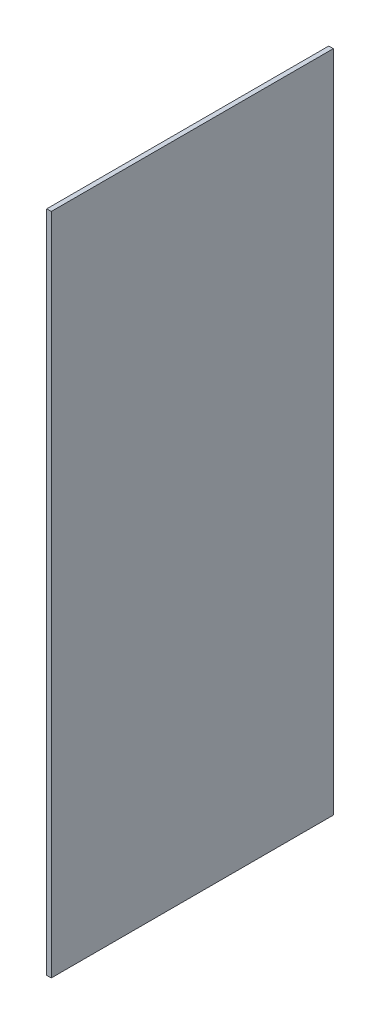
ISO-10303-21;
HEADER;
FILE_DESCRIPTION(('STEP AP214'),'2;1');
FILE_NAME('part.step','',(''),(''),'','','');
FILE_SCHEMA(('AUTOMOTIVE_DESIGN { 1 0 10303 214 1 1 1 1 }'));
ENDSEC;
DATA;
#1=APPLICATION_CONTEXT('core data for automotive mechanical design processes');
#2=APPLICATION_PROTOCOL_DEFINITION('international standard','automotive_design',2000,#1);
#3=PRODUCT_CONTEXT('',#1,'mechanical');
#4=PRODUCT('Part','Part','',(#3));
#5=PRODUCT_RELATED_PRODUCT_CATEGORY('part','',(#4));
#6=PRODUCT_DEFINITION_FORMATION('','',#4);
#7=PRODUCT_DEFINITION_CONTEXT('part definition',#1,'design');
#8=PRODUCT_DEFINITION('design','',#6,#7);
#9=PRODUCT_DEFINITION_SHAPE('','',#8);
#10=(LENGTH_UNIT() NAMED_UNIT(*) SI_UNIT(.MILLI.,.METRE.));
#11=(NAMED_UNIT(*) PLANE_ANGLE_UNIT() SI_UNIT($,.RADIAN.));
#12=(NAMED_UNIT(*) SI_UNIT($,.STERADIAN.) SOLID_ANGLE_UNIT());
#13=UNCERTAINTY_MEASURE_WITH_UNIT(LENGTH_MEASURE(1.E-05),#10,'distance_accuracy_value','');
#14=(GEOMETRIC_REPRESENTATION_CONTEXT(3) GLOBAL_UNCERTAINTY_ASSIGNED_CONTEXT((#13)) GLOBAL_UNIT_ASSIGNED_CONTEXT((#10,
#11,#12)) REPRESENTATION_CONTEXT('',''));
#15=CARTESIAN_POINT('',(0.,0.,0.));
#16=DIRECTION('',(0.,0.,1.));
#17=DIRECTION('',(1.,0.,0.));
#18=AXIS2_PLACEMENT_3D('',#15,#16,#17);
#19=CARTESIAN_POINT('',(3.175,0.,0.));
#20=DIRECTION('',(0.,0.,1.));
#21=DIRECTION('',(1.,0.,0.));
#22=AXIS2_PLACEMENT_3D('',#19,#20,#21);
#23=PLANE('',#22);
#24=DIRECTION('',(0.,1.,0.));
#25=VECTOR('',#24,1.);
#26=CARTESIAN_POINT('',(0.,0.,0.));
#27=LINE('',#26,#25);
#28=CARTESIAN_POINT('',(0.,0.,0.));
#29=VERTEX_POINT('',#28);
#30=CARTESIAN_POINT('',(0.,461.518,0.));
#31=VERTEX_POINT('',#30);
#32=EDGE_CURVE('E107',#29,#31,#27,.T.);
#33=ORIENTED_EDGE('',*,*,#32,.T.);
#34=DIRECTION('',(-1.,0.,0.));
#35=VECTOR('',#34,1.);
#36=CARTESIAN_POINT('',(3.175,461.518,0.));
#37=LINE('',#36,#35);
#38=CARTESIAN_POINT('',(3.175,461.518,0.));
#39=VERTEX_POINT('',#38);
#40=EDGE_CURVE('E11',#39,#31,#37,.T.);
#41=ORIENTED_EDGE('',*,*,#40,.F.);
#42=DIRECTION('',(0.,1.,0.));
#43=VECTOR('',#42,1.);
#44=CARTESIAN_POINT('',(3.175,0.,0.));
#45=LINE('',#44,#43);
#46=CARTESIAN_POINT('',(3.175,0.,0.));
#47=VERTEX_POINT('',#46);
#48=EDGE_CURVE('E91',#47,#39,#45,.T.);
#49=ORIENTED_EDGE('',*,*,#48,.F.);
#50=DIRECTION('',(-1.,0.,0.));
#51=VECTOR('',#50,1.);
#52=CARTESIAN_POINT('',(3.175,0.,0.));
#53=LINE('',#52,#51);
#54=EDGE_CURVE('E103',#47,#29,#53,.T.);
#55=ORIENTED_EDGE('',*,*,#54,.T.);
#56=EDGE_LOOP('',(#33,#41,#49,#55));
#57=FACE_BOUND('',#56,.T.);
#58=ADVANCED_FACE('F39',(#57),#23,.F.);
#59=CARTESIAN_POINT('',(3.175,461.518,0.));
#60=DIRECTION('',(0.,-1.,0.));
#61=DIRECTION('',(0.,0.,-1.));
#62=AXIS2_PLACEMENT_3D('',#59,#60,#61);
#63=PLANE('',#62);
#64=DIRECTION('',(0.,0.,1.));
#65=VECTOR('',#64,1.);
#66=CARTESIAN_POINT('',(0.,461.518,0.));
#67=LINE('',#66,#65);
#68=CARTESIAN_POINT('',(0.,461.518,196.088));
#69=VERTEX_POINT('',#68);
#70=EDGE_CURVE('E96',#31,#69,#67,.T.);
#71=ORIENTED_EDGE('',*,*,#70,.T.);
#72=DIRECTION('',(-1.,0.,0.));
#73=VECTOR('',#72,1.);
#74=CARTESIAN_POINT('',(3.175,461.518,196.088));
#75=LINE('',#74,#73);
#76=CARTESIAN_POINT('',(3.175,461.518,196.088));
#77=VERTEX_POINT('',#76);
#78=EDGE_CURVE('E48',#77,#69,#75,.T.);
#79=ORIENTED_EDGE('',*,*,#78,.F.);
#80=DIRECTION('',(0.,0.,1.));
#81=VECTOR('',#80,1.);
#82=CARTESIAN_POINT('',(3.175,461.518,0.));
#83=LINE('',#82,#81);
#84=EDGE_CURVE('E86',#39,#77,#83,.T.);
#85=ORIENTED_EDGE('',*,*,#84,.F.);
#86=ORIENTED_EDGE('',*,*,#40,.T.);
#87=EDGE_LOOP('',(#71,#79,#85,#86));
#88=FACE_BOUND('',#87,.T.);
#89=ADVANCED_FACE('F95',(#88),#63,.F.);
#90=CARTESIAN_POINT('',(3.175,0.,196.088));
#91=DIRECTION('',(0.,0.,-1.));
#92=DIRECTION('',(0.,1.,0.));
#93=AXIS2_PLACEMENT_3D('',#90,#91,#92);
#94=PLANE('',#93);
#95=DIRECTION('',(0.,-1.,0.));
#96=VECTOR('',#95,1.);
#97=CARTESIAN_POINT('',(0.,0.,196.088));
#98=LINE('',#97,#96);
#99=CARTESIAN_POINT('',(0.,0.,196.088));
#100=VERTEX_POINT('',#99);
#101=EDGE_CURVE('E73',#69,#100,#98,.T.);
#102=ORIENTED_EDGE('',*,*,#101,.T.);
#103=DIRECTION('',(-1.,0.,0.));
#104=VECTOR('',#103,1.);
#105=CARTESIAN_POINT('',(3.175,0.,196.088));
#106=LINE('',#105,#104);
#107=CARTESIAN_POINT('',(3.175,0.,196.088));
#108=VERTEX_POINT('',#107);
#109=EDGE_CURVE('E98',#108,#100,#106,.T.);
#110=ORIENTED_EDGE('',*,*,#109,.F.);
#111=DIRECTION('',(0.,-1.,0.));
#112=VECTOR('',#111,1.);
#113=CARTESIAN_POINT('',(3.175,0.,196.088));
#114=LINE('',#113,#112);
#115=EDGE_CURVE('E89',#77,#108,#114,.T.);
#116=ORIENTED_EDGE('',*,*,#115,.F.);
#117=ORIENTED_EDGE('',*,*,#78,.T.);
#118=EDGE_LOOP('',(#102,#110,#116,#117));
#119=FACE_BOUND('',#118,.T.);
#120=ADVANCED_FACE('F99',(#119),#94,.F.);
#121=CARTESIAN_POINT('',(3.175,0.,0.));
#122=DIRECTION('',(0.,1.,0.));
#123=DIRECTION('',(0.,0.,1.));
#124=AXIS2_PLACEMENT_3D('',#121,#122,#123);
#125=PLANE('',#124);
#126=DIRECTION('',(0.,0.,-1.));
#127=VECTOR('',#126,1.);
#128=CARTESIAN_POINT('',(0.,0.,0.));
#129=LINE('',#128,#127);
#130=EDGE_CURVE('E79',#100,#29,#129,.T.);
#131=ORIENTED_EDGE('',*,*,#130,.T.);
#132=ORIENTED_EDGE('',*,*,#54,.F.);
#133=DIRECTION('',(0.,0.,-1.));
#134=VECTOR('',#133,1.);
#135=CARTESIAN_POINT('',(3.175,0.,0.));
#136=LINE('',#135,#134);
#137=EDGE_CURVE('E56',#108,#47,#136,.T.);
#138=ORIENTED_EDGE('',*,*,#137,.F.);
#139=ORIENTED_EDGE('',*,*,#109,.T.);
#140=EDGE_LOOP('',(#131,#132,#138,#139));
#141=FACE_BOUND('',#140,.T.);
#142=ADVANCED_FACE('F120',(#141),#125,.F.);
#143=CARTESIAN_POINT('',(3.175,0.,0.));
#144=DIRECTION('',(1.,0.,0.));
#145=DIRECTION('',(0.,0.,-1.));
#146=AXIS2_PLACEMENT_3D('',#143,#144,#145);
#147=PLANE('',#146);
#148=ORIENTED_EDGE('',*,*,#48,.T.);
#149=ORIENTED_EDGE('',*,*,#84,.T.);
#150=ORIENTED_EDGE('',*,*,#115,.T.);
#151=ORIENTED_EDGE('',*,*,#137,.T.);
#152=EDGE_LOOP('',(#148,#149,#150,#151));
#153=FACE_BOUND('',#152,.T.);
#154=ADVANCED_FACE('F87',(#153),#147,.T.);
#155=CARTESIAN_POINT('',(0.,0.,0.));
#156=DIRECTION('',(1.,0.,0.));
#157=DIRECTION('',(0.,0.,-1.));
#158=AXIS2_PLACEMENT_3D('',#155,#156,#157);
#159=PLANE('',#158);
#160=ORIENTED_EDGE('',*,*,#32,.F.);
#161=ORIENTED_EDGE('',*,*,#130,.F.);
#162=ORIENTED_EDGE('',*,*,#101,.F.);
#163=ORIENTED_EDGE('',*,*,#70,.F.);
#164=EDGE_LOOP('',(#160,#161,#162,#163));
#165=FACE_BOUND('',#164,.T.);
#166=ADVANCED_FACE('F123',(#165),#159,.F.);
#167=CLOSED_SHELL('',(#58,#89,#120,#142,#154,#166));
#168=MANIFOLD_SOLID_BREP('B2',#167);
#169=ADVANCED_BREP_SHAPE_REPRESENTATION('',(#18,#168),#14);
#170=SHAPE_DEFINITION_REPRESENTATION(#9,#169);
ENDSEC;
END-ISO-10303-21;
